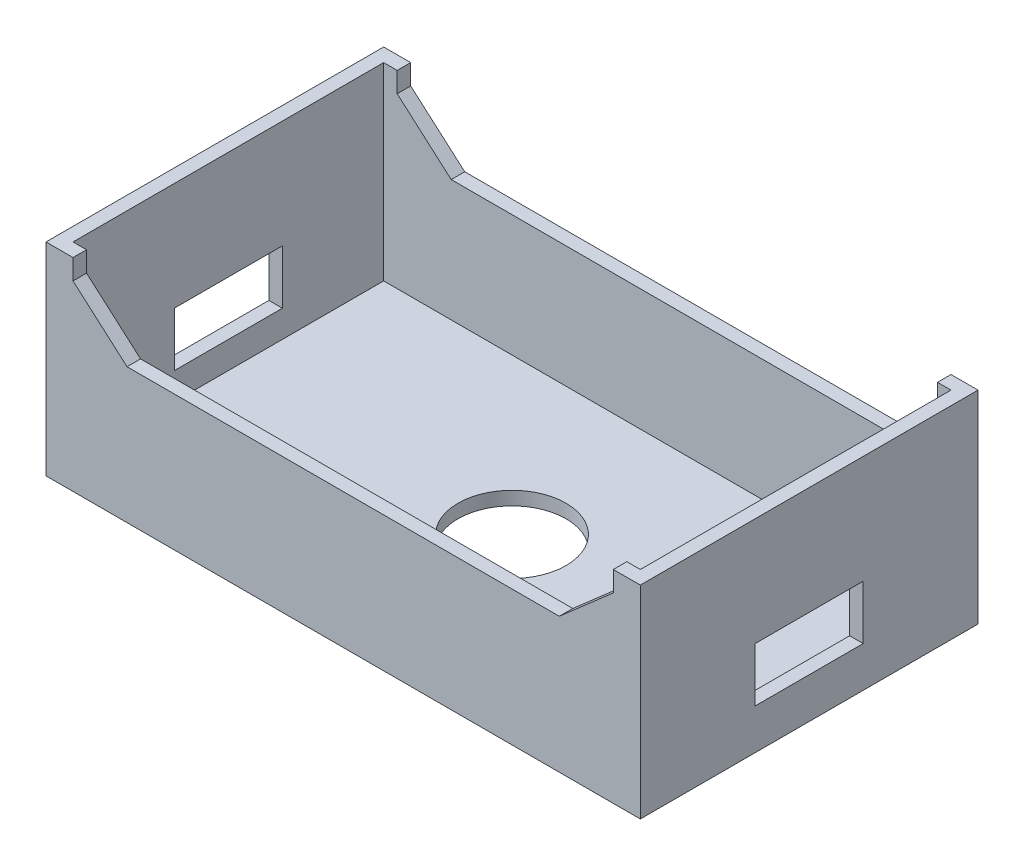
ISO-10303-21;
HEADER;
FILE_DESCRIPTION(('STEP AP214'),'2;1');
FILE_NAME('part.step','',(''),(''),'','','');
FILE_SCHEMA(('AUTOMOTIVE_DESIGN { 1 0 10303 214 1 1 1 1 }'));
ENDSEC;
DATA;
#1=APPLICATION_CONTEXT('core data for automotive mechanical design processes');
#2=APPLICATION_PROTOCOL_DEFINITION('international standard','automotive_design',2000,#1);
#3=PRODUCT_CONTEXT('',#1,'mechanical');
#4=PRODUCT('Part','Part','',(#3));
#5=PRODUCT_RELATED_PRODUCT_CATEGORY('part','',(#4));
#6=PRODUCT_DEFINITION_FORMATION('','',#4);
#7=PRODUCT_DEFINITION_CONTEXT('part definition',#1,'design');
#8=PRODUCT_DEFINITION('design','',#6,#7);
#9=PRODUCT_DEFINITION_SHAPE('','',#8);
#10=(LENGTH_UNIT() NAMED_UNIT(*) SI_UNIT(.MILLI.,.METRE.));
#11=(NAMED_UNIT(*) PLANE_ANGLE_UNIT() SI_UNIT($,.RADIAN.));
#12=(NAMED_UNIT(*) SI_UNIT($,.STERADIAN.) SOLID_ANGLE_UNIT());
#13=UNCERTAINTY_MEASURE_WITH_UNIT(LENGTH_MEASURE(1.E-05),#10,'distance_accuracy_value','');
#14=(GEOMETRIC_REPRESENTATION_CONTEXT(3) GLOBAL_UNCERTAINTY_ASSIGNED_CONTEXT((#13)) GLOBAL_UNIT_ASSIGNED_CONTEXT((#10,
#11,#12)) REPRESENTATION_CONTEXT('',''));
#15=CARTESIAN_POINT('',(0.,0.,0.));
#16=DIRECTION('',(0.,0.,1.));
#17=DIRECTION('',(1.,0.,0.));
#18=AXIS2_PLACEMENT_3D('',#15,#16,#17);
#19=CARTESIAN_POINT('',(21.,1.,-11.5));
#20=DIRECTION('',(0.,0.,-1.));
#21=DIRECTION('',(-1.,0.,0.));
#22=AXIS2_PLACEMENT_3D('',#19,#20,#21);
#23=PLANE('',#22);
#24=DIRECTION('',(0.,1.,0.));
#25=VECTOR('',#24,1.);
#26=CARTESIAN_POINT('',(21.,1.,-11.5));
#27=LINE('',#26,#25);
#28=CARTESIAN_POINT('',(21.,1.,-11.5));
#29=VERTEX_POINT('',#28);
#30=CARTESIAN_POINT('',(21.,15.,-11.5));
#31=VERTEX_POINT('',#30);
#32=EDGE_CURVE('E397',#29,#31,#27,.T.);
#33=ORIENTED_EDGE('',*,*,#32,.T.);
#34=DIRECTION('',(-1.,0.,0.));
#35=VECTOR('',#34,1.);
#36=CARTESIAN_POINT('',(0.,15.,-11.5));
#37=LINE('',#36,#35);
#38=CARTESIAN_POINT('',(20.,15.,-11.5));
#39=VERTEX_POINT('',#38);
#40=EDGE_CURVE('E298',#31,#39,#37,.T.);
#41=ORIENTED_EDGE('',*,*,#40,.T.);
#42=DIRECTION('',(0.,1.,0.));
#43=VECTOR('',#42,1.);
#44=CARTESIAN_POINT('',(20.,0.,-11.5));
#45=LINE('',#44,#43);
#46=CARTESIAN_POINT('',(20.,13.5,-11.5));
#47=VERTEX_POINT('',#46);
#48=EDGE_CURVE('E43',#47,#39,#45,.T.);
#49=ORIENTED_EDGE('',*,*,#48,.F.);
#50=DIRECTION('',(-0.752576694706878,-0.658504607868518,0.));
#51=VECTOR('',#50,1.);
#52=CARTESIAN_POINT('',(1.98230088495574,-2.26548672566371,-11.5));
#53=LINE('',#52,#51);
#54=CARTESIAN_POINT('',(16.,10.,-11.5));
#55=VERTEX_POINT('',#54);
#56=EDGE_CURVE('E296',#47,#55,#53,.T.);
#57=ORIENTED_EDGE('',*,*,#56,.T.);
#58=DIRECTION('',(-1.,0.,0.));
#59=VECTOR('',#58,1.);
#60=CARTESIAN_POINT('',(21.,10.,-11.5));
#61=LINE('',#60,#59);
#62=CARTESIAN_POINT('',(-16.,10.,-11.5));
#63=VERTEX_POINT('',#62);
#64=EDGE_CURVE('E380',#55,#63,#61,.T.);
#65=ORIENTED_EDGE('',*,*,#64,.T.);
#66=DIRECTION('',(0.752576694706878,-0.658504607868518,0.));
#67=VECTOR('',#66,1.);
#68=CARTESIAN_POINT('',(-1.98230088495574,-2.26548672566371,-11.5));
#69=LINE('',#68,#67);
#70=CARTESIAN_POINT('',(-20.,13.5,-11.5));
#71=VERTEX_POINT('',#70);
#72=EDGE_CURVE('E300',#71,#63,#69,.T.);
#73=ORIENTED_EDGE('',*,*,#72,.F.);
#74=DIRECTION('',(0.,1.,0.));
#75=VECTOR('',#74,1.);
#76=CARTESIAN_POINT('',(-20.,0.,-11.5));
#77=LINE('',#76,#75);
#78=CARTESIAN_POINT('',(-20.,15.,-11.5));
#79=VERTEX_POINT('',#78);
#80=EDGE_CURVE('E302',#71,#79,#77,.T.);
#81=ORIENTED_EDGE('',*,*,#80,.T.);
#82=DIRECTION('',(-1.,0.,0.));
#83=VECTOR('',#82,1.);
#84=CARTESIAN_POINT('',(0.,15.,-11.5));
#85=LINE('',#84,#83);
#86=CARTESIAN_POINT('',(-21.,15.,-11.5));
#87=VERTEX_POINT('',#86);
#88=EDGE_CURVE('E304',#79,#87,#85,.T.);
#89=ORIENTED_EDGE('',*,*,#88,.T.);
#90=DIRECTION('',(0.,1.,0.));
#91=VECTOR('',#90,1.);
#92=CARTESIAN_POINT('',(-21.,1.,-11.5));
#93=LINE('',#92,#91);
#94=CARTESIAN_POINT('',(-21.,1.,-11.5));
#95=VERTEX_POINT('',#94);
#96=EDGE_CURVE('E394',#95,#87,#93,.T.);
#97=ORIENTED_EDGE('',*,*,#96,.F.);
#98=DIRECTION('',(-1.,0.,0.));
#99=VECTOR('',#98,1.);
#100=CARTESIAN_POINT('',(21.,1.,-11.5));
#101=LINE('',#100,#99);
#102=EDGE_CURVE('E386',#29,#95,#101,.T.);
#103=ORIENTED_EDGE('',*,*,#102,.F.);
#104=EDGE_LOOP('',(#33,#41,#49,#57,#65,#73,#81,#89,#97,#103));
#105=FACE_BOUND('',#104,.T.);
#106=ADVANCED_FACE('F34',(#105),#23,.F.);
#107=CARTESIAN_POINT('',(21.,1.,11.5));
#108=DIRECTION('',(0.,0.,1.));
#109=DIRECTION('',(1.,0.,0.));
#110=AXIS2_PLACEMENT_3D('',#107,#108,#109);
#111=PLANE('',#110);
#112=DIRECTION('',(1.,0.,0.));
#113=VECTOR('',#112,1.);
#114=CARTESIAN_POINT('',(0.,15.,11.5));
#115=LINE('',#114,#113);
#116=CARTESIAN_POINT('',(20.,15.,11.5));
#117=VERTEX_POINT('',#116);
#118=CARTESIAN_POINT('',(21.,15.,11.5));
#119=VERTEX_POINT('',#118);
#120=EDGE_CURVE('E309',#117,#119,#115,.T.);
#121=ORIENTED_EDGE('',*,*,#120,.T.);
#122=DIRECTION('',(0.,1.,0.));
#123=VECTOR('',#122,1.);
#124=CARTESIAN_POINT('',(21.,1.,11.5));
#125=LINE('',#124,#123);
#126=CARTESIAN_POINT('',(21.,1.,11.5));
#127=VERTEX_POINT('',#126);
#128=EDGE_CURVE('E399',#127,#119,#125,.T.);
#129=ORIENTED_EDGE('',*,*,#128,.F.);
#130=DIRECTION('',(1.,0.,0.));
#131=VECTOR('',#130,1.);
#132=CARTESIAN_POINT('',(21.,1.,11.5));
#133=LINE('',#132,#131);
#134=CARTESIAN_POINT('',(-21.,1.,11.5));
#135=VERTEX_POINT('',#134);
#136=EDGE_CURVE('E379',#135,#127,#133,.T.);
#137=ORIENTED_EDGE('',*,*,#136,.F.);
#138=DIRECTION('',(0.,1.,0.));
#139=VECTOR('',#138,1.);
#140=CARTESIAN_POINT('',(-21.,1.,11.5));
#141=LINE('',#140,#139);
#142=CARTESIAN_POINT('',(-21.,15.,11.5));
#143=VERTEX_POINT('',#142);
#144=EDGE_CURVE('E389',#135,#143,#141,.T.);
#145=ORIENTED_EDGE('',*,*,#144,.T.);
#146=DIRECTION('',(1.,0.,0.));
#147=VECTOR('',#146,1.);
#148=CARTESIAN_POINT('',(0.,15.,11.5));
#149=LINE('',#148,#147);
#150=CARTESIAN_POINT('',(-20.,15.,11.5));
#151=VERTEX_POINT('',#150);
#152=EDGE_CURVE('E317',#143,#151,#149,.T.);
#153=ORIENTED_EDGE('',*,*,#152,.T.);
#154=DIRECTION('',(0.,-1.,0.));
#155=VECTOR('',#154,1.);
#156=CARTESIAN_POINT('',(-20.,0.,11.5));
#157=LINE('',#156,#155);
#158=CARTESIAN_POINT('',(-20.,13.5,11.5));
#159=VERTEX_POINT('',#158);
#160=EDGE_CURVE('E315',#151,#159,#157,.T.);
#161=ORIENTED_EDGE('',*,*,#160,.T.);
#162=DIRECTION('',(-0.752576694706878,0.658504607868518,0.));
#163=VECTOR('',#162,1.);
#164=CARTESIAN_POINT('',(-1.98230088495574,-2.26548672566371,11.5));
#165=LINE('',#164,#163);
#166=CARTESIAN_POINT('',(-16.,9.99999999999999,11.5));
#167=VERTEX_POINT('',#166);
#168=EDGE_CURVE('E312',#167,#159,#165,.T.);
#169=ORIENTED_EDGE('',*,*,#168,.F.);
#170=DIRECTION('',(1.,0.,0.));
#171=VECTOR('',#170,1.);
#172=CARTESIAN_POINT('',(21.,10.,11.5));
#173=LINE('',#172,#171);
#174=CARTESIAN_POINT('',(16.,10.,11.5));
#175=VERTEX_POINT('',#174);
#176=EDGE_CURVE('E367',#167,#175,#173,.T.);
#177=ORIENTED_EDGE('',*,*,#176,.T.);
#178=DIRECTION('',(0.752576694706878,0.658504607868518,0.));
#179=VECTOR('',#178,1.);
#180=CARTESIAN_POINT('',(1.98230088495574,-2.26548672566371,11.5));
#181=LINE('',#180,#179);
#182=CARTESIAN_POINT('',(20.,13.5,11.5));
#183=VERTEX_POINT('',#182);
#184=EDGE_CURVE('E307',#175,#183,#181,.T.);
#185=ORIENTED_EDGE('',*,*,#184,.T.);
#186=DIRECTION('',(0.,-1.,0.));
#187=VECTOR('',#186,1.);
#188=CARTESIAN_POINT('',(20.,0.,11.5));
#189=LINE('',#188,#187);
#190=EDGE_CURVE('E11',#117,#183,#189,.T.);
#191=ORIENTED_EDGE('',*,*,#190,.F.);
#192=EDGE_LOOP('',(#121,#129,#137,#145,#153,#161,#169,#177,#185,#191));
#193=FACE_BOUND('',#192,.T.);
#194=ADVANCED_FACE('F479',(#193),#111,.F.);
#195=CARTESIAN_POINT('',(22.,10.,12.5));
#196=DIRECTION('',(0.,0.,-1.));
#197=DIRECTION('',(-1.,0.,0.));
#198=AXIS2_PLACEMENT_3D('',#195,#196,#197);
#199=PLANE('',#198);
#200=DIRECTION('',(1.,0.,0.));
#201=VECTOR('',#200,1.);
#202=CARTESIAN_POINT('',(0.,15.,12.5));
#203=LINE('',#202,#201);
#204=CARTESIAN_POINT('',(-22.,15.,12.5));
#205=VERTEX_POINT('',#204);
#206=CARTESIAN_POINT('',(-20.,15.,12.5));
#207=VERTEX_POINT('',#206);
#208=EDGE_CURVE('E353',#205,#207,#203,.T.);
#209=ORIENTED_EDGE('',*,*,#208,.F.);
#210=DIRECTION('',(0.,-1.,0.));
#211=VECTOR('',#210,1.);
#212=CARTESIAN_POINT('',(-22.,10.,12.5));
#213=LINE('',#212,#211);
#214=CARTESIAN_POINT('',(-22.,0.,12.5));
#215=VERTEX_POINT('',#214);
#216=EDGE_CURVE('E424',#205,#215,#213,.T.);
#217=ORIENTED_EDGE('',*,*,#216,.T.);
#218=DIRECTION('',(1.,0.,0.));
#219=VECTOR('',#218,1.);
#220=CARTESIAN_POINT('',(22.,0.,12.5));
#221=LINE('',#220,#219);
#222=CARTESIAN_POINT('',(22.,0.,12.5));
#223=VERTEX_POINT('',#222);
#224=EDGE_CURVE('E411',#215,#223,#221,.T.);
#225=ORIENTED_EDGE('',*,*,#224,.T.);
#226=DIRECTION('',(0.,-1.,0.));
#227=VECTOR('',#226,1.);
#228=CARTESIAN_POINT('',(22.,10.,12.5));
#229=LINE('',#228,#227);
#230=CARTESIAN_POINT('',(22.,15.,12.5));
#231=VERTEX_POINT('',#230);
#232=EDGE_CURVE('E422',#231,#223,#229,.T.);
#233=ORIENTED_EDGE('',*,*,#232,.F.);
#234=DIRECTION('',(1.,0.,0.));
#235=VECTOR('',#234,1.);
#236=CARTESIAN_POINT('',(0.,15.,12.5));
#237=LINE('',#236,#235);
#238=CARTESIAN_POINT('',(20.,15.,12.5));
#239=VERTEX_POINT('',#238);
#240=EDGE_CURVE('E319',#239,#231,#237,.T.);
#241=ORIENTED_EDGE('',*,*,#240,.F.);
#242=DIRECTION('',(0.,-1.,0.));
#243=VECTOR('',#242,1.);
#244=CARTESIAN_POINT('',(20.,0.,12.5));
#245=LINE('',#244,#243);
#246=CARTESIAN_POINT('',(20.,13.5,12.5));
#247=VERTEX_POINT('',#246);
#248=EDGE_CURVE('E332',#239,#247,#245,.T.);
#249=ORIENTED_EDGE('',*,*,#248,.T.);
#250=DIRECTION('',(0.752576694706878,0.658504607868518,0.));
#251=VECTOR('',#250,1.);
#252=CARTESIAN_POINT('',(1.98230088495574,-2.26548672566371,12.5));
#253=LINE('',#252,#251);
#254=CARTESIAN_POINT('',(16.,10.,12.5));
#255=VERTEX_POINT('',#254);
#256=EDGE_CURVE('E324',#255,#247,#253,.T.);
#257=ORIENTED_EDGE('',*,*,#256,.F.);
#258=DIRECTION('',(1.,0.,0.));
#259=VECTOR('',#258,1.);
#260=CARTESIAN_POINT('',(22.,10.,12.5));
#261=LINE('',#260,#259);
#262=CARTESIAN_POINT('',(-16.,10.,12.5));
#263=VERTEX_POINT('',#262);
#264=EDGE_CURVE('E402',#263,#255,#261,.T.);
#265=ORIENTED_EDGE('',*,*,#264,.F.);
#266=DIRECTION('',(-0.752576694706878,0.658504607868518,0.));
#267=VECTOR('',#266,1.);
#268=CARTESIAN_POINT('',(-1.98230088495574,-2.26548672566371,12.5));
#269=LINE('',#268,#267);
#270=CARTESIAN_POINT('',(-20.,13.5,12.5));
#271=VERTEX_POINT('',#270);
#272=EDGE_CURVE('E340',#263,#271,#269,.T.);
#273=ORIENTED_EDGE('',*,*,#272,.T.);
#274=DIRECTION('',(0.,-1.,0.));
#275=VECTOR('',#274,1.);
#276=CARTESIAN_POINT('',(-20.,0.,12.5));
#277=LINE('',#276,#275);
#278=EDGE_CURVE('E360',#207,#271,#277,.T.);
#279=ORIENTED_EDGE('',*,*,#278,.F.);
#280=EDGE_LOOP('',(#209,#217,#225,#233,#241,#249,#257,#265,#273,#279));
#281=FACE_BOUND('',#280,.T.);
#282=ADVANCED_FACE('F492',(#281),#199,.F.);
#283=CARTESIAN_POINT('',(22.,10.,-12.5));
#284=DIRECTION('',(0.,0.,1.));
#285=DIRECTION('',(1.,0.,0.));
#286=AXIS2_PLACEMENT_3D('',#283,#284,#285);
#287=PLANE('',#286);
#288=DIRECTION('',(0.,-1.,0.));
#289=VECTOR('',#288,1.);
#290=CARTESIAN_POINT('',(-22.,10.,-12.5));
#291=LINE('',#290,#289);
#292=CARTESIAN_POINT('',(-22.,15.,-12.5));
#293=VERTEX_POINT('',#292);
#294=CARTESIAN_POINT('',(-22.,0.,-12.5));
#295=VERTEX_POINT('',#294);
#296=EDGE_CURVE('E408',#293,#295,#291,.T.);
#297=ORIENTED_EDGE('',*,*,#296,.F.);
#298=DIRECTION('',(1.,0.,0.));
#299=VECTOR('',#298,1.);
#300=CARTESIAN_POINT('',(0.,15.,-12.5));
#301=LINE('',#300,#299);
#302=CARTESIAN_POINT('',(-20.,15.,-12.5));
#303=VERTEX_POINT('',#302);
#304=EDGE_CURVE('E355',#293,#303,#301,.T.);
#305=ORIENTED_EDGE('',*,*,#304,.T.);
#306=DIRECTION('',(0.,-1.,0.));
#307=VECTOR('',#306,1.);
#308=CARTESIAN_POINT('',(-20.,0.,-12.5));
#309=LINE('',#308,#307);
#310=CARTESIAN_POINT('',(-20.,13.5,-12.5));
#311=VERTEX_POINT('',#310);
#312=EDGE_CURVE('E352',#303,#311,#309,.T.);
#313=ORIENTED_EDGE('',*,*,#312,.T.);
#314=DIRECTION('',(-0.752576694706878,0.658504607868518,0.));
#315=VECTOR('',#314,1.);
#316=CARTESIAN_POINT('',(-1.98230088495574,-2.26548672566371,-12.5));
#317=LINE('',#316,#315);
#318=CARTESIAN_POINT('',(-16.,10.,-12.5));
#319=VERTEX_POINT('',#318);
#320=EDGE_CURVE('E349',#319,#311,#317,.T.);
#321=ORIENTED_EDGE('',*,*,#320,.F.);
#322=DIRECTION('',(-1.,0.,0.));
#323=VECTOR('',#322,1.);
#324=CARTESIAN_POINT('',(22.,10.,-12.5));
#325=LINE('',#324,#323);
#326=CARTESIAN_POINT('',(16.,10.,-12.5));
#327=VERTEX_POINT('',#326);
#328=EDGE_CURVE('E405',#327,#319,#325,.T.);
#329=ORIENTED_EDGE('',*,*,#328,.F.);
#330=DIRECTION('',(0.752576694706878,0.658504607868518,0.));
#331=VECTOR('',#330,1.);
#332=CARTESIAN_POINT('',(1.98230088495574,-2.26548672566371,-12.5));
#333=LINE('',#332,#331);
#334=CARTESIAN_POINT('',(20.,13.5,-12.5));
#335=VERTEX_POINT('',#334);
#336=EDGE_CURVE('E327',#327,#335,#333,.T.);
#337=ORIENTED_EDGE('',*,*,#336,.T.);
#338=DIRECTION('',(0.,-1.,0.));
#339=VECTOR('',#338,1.);
#340=CARTESIAN_POINT('',(20.,0.,-12.5));
#341=LINE('',#340,#339);
#342=CARTESIAN_POINT('',(20.,15.,-12.5));
#343=VERTEX_POINT('',#342);
#344=EDGE_CURVE('E323',#343,#335,#341,.T.);
#345=ORIENTED_EDGE('',*,*,#344,.F.);
#346=DIRECTION('',(1.,0.,0.));
#347=VECTOR('',#346,1.);
#348=CARTESIAN_POINT('',(0.,15.,-12.5));
#349=LINE('',#348,#347);
#350=CARTESIAN_POINT('',(22.,15.,-12.5));
#351=VERTEX_POINT('',#350);
#352=EDGE_CURVE('E320',#343,#351,#349,.T.);
#353=ORIENTED_EDGE('',*,*,#352,.T.);
#354=DIRECTION('',(0.,-1.,0.));
#355=VECTOR('',#354,1.);
#356=CARTESIAN_POINT('',(22.,10.,-12.5));
#357=LINE('',#356,#355);
#358=CARTESIAN_POINT('',(22.,0.,-12.5));
#359=VERTEX_POINT('',#358);
#360=EDGE_CURVE('E420',#351,#359,#357,.T.);
#361=ORIENTED_EDGE('',*,*,#360,.T.);
#362=DIRECTION('',(-1.,0.,0.));
#363=VECTOR('',#362,1.);
#364=CARTESIAN_POINT('',(22.,0.,-12.5));
#365=LINE('',#364,#363);
#366=EDGE_CURVE('E406',#359,#295,#365,.T.);
#367=ORIENTED_EDGE('',*,*,#366,.T.);
#368=EDGE_LOOP('',(#297,#305,#313,#321,#329,#337,#345,#353,#361,#367));
#369=FACE_BOUND('',#368,.T.);
#370=ADVANCED_FACE('F441',(#369),#287,.F.);
#371=CARTESIAN_POINT('',(0.,15.,-12.5));
#372=DIRECTION('',(0.,-1.,0.));
#373=DIRECTION('',(0.,0.,-1.));
#374=AXIS2_PLACEMENT_3D('',#371,#372,#373);
#375=PLANE('',#374);
#376=ORIENTED_EDGE('',*,*,#304,.F.);
#377=DIRECTION('',(0.,0.,-1.));
#378=VECTOR('',#377,1.);
#379=CARTESIAN_POINT('',(-22.,15.,-12.5));
#380=LINE('',#379,#378);
#381=EDGE_CURVE('E292',#205,#293,#380,.T.);
#382=ORIENTED_EDGE('',*,*,#381,.F.);
#383=ORIENTED_EDGE('',*,*,#208,.T.);
#384=DIRECTION('',(0.,0.,1.));
#385=VECTOR('',#384,1.);
#386=CARTESIAN_POINT('',(-20.,15.,-12.5));
#387=LINE('',#386,#385);
#388=EDGE_CURVE('E368',#151,#207,#387,.T.);
#389=ORIENTED_EDGE('',*,*,#388,.F.);
#390=ORIENTED_EDGE('',*,*,#152,.F.);
#391=DIRECTION('',(0.,0.,-1.));
#392=VECTOR('',#391,1.);
#393=CARTESIAN_POINT('',(-21.,15.,0.));
#394=LINE('',#393,#392);
#395=EDGE_CURVE('E289',#143,#87,#394,.T.);
#396=ORIENTED_EDGE('',*,*,#395,.T.);
#397=ORIENTED_EDGE('',*,*,#88,.F.);
#398=EDGE_CURVE('E364',#303,#79,#387,.T.);
#399=ORIENTED_EDGE('',*,*,#398,.F.);
#400=EDGE_LOOP('',(#376,#382,#383,#389,#390,#396,#397,#399));
#401=FACE_BOUND('',#400,.T.);
#402=ADVANCED_FACE('F462',(#401),#375,.F.);
#403=CARTESIAN_POINT('',(0.,15.,-12.5));
#404=DIRECTION('',(0.,-1.,0.));
#405=DIRECTION('',(1.,0.,0.));
#406=AXIS2_PLACEMENT_3D('',#403,#404,#405);
#407=PLANE('',#406);
#408=ORIENTED_EDGE('',*,*,#240,.T.);
#409=DIRECTION('',(0.,0.,1.));
#410=VECTOR('',#409,1.);
#411=CARTESIAN_POINT('',(22.,15.,-12.5));
#412=LINE('',#411,#410);
#413=EDGE_CURVE('E294',#351,#231,#412,.T.);
#414=ORIENTED_EDGE('',*,*,#413,.F.);
#415=ORIENTED_EDGE('',*,*,#352,.F.);
#416=DIRECTION('',(0.,0.,1.));
#417=VECTOR('',#416,1.);
#418=CARTESIAN_POINT('',(20.,15.,-12.5));
#419=LINE('',#418,#417);
#420=EDGE_CURVE('E346',#343,#39,#419,.T.);
#421=ORIENTED_EDGE('',*,*,#420,.T.);
#422=ORIENTED_EDGE('',*,*,#40,.F.);
#423=DIRECTION('',(0.,0.,-1.));
#424=VECTOR('',#423,1.);
#425=CARTESIAN_POINT('',(21.,15.,0.));
#426=LINE('',#425,#424);
#427=EDGE_CURVE('E286',#119,#31,#426,.T.);
#428=ORIENTED_EDGE('',*,*,#427,.F.);
#429=ORIENTED_EDGE('',*,*,#120,.F.);
#430=EDGE_CURVE('E329',#117,#239,#419,.T.);
#431=ORIENTED_EDGE('',*,*,#430,.T.);
#432=EDGE_LOOP('',(#408,#414,#415,#421,#422,#428,#429,#431));
#433=FACE_BOUND('',#432,.T.);
#434=ADVANCED_FACE('F435',(#433),#407,.F.);
#435=CARTESIAN_POINT('',(21.,1.,11.5));
#436=DIRECTION('',(1.,0.,0.));
#437=DIRECTION('',(0.,0.,-1.));
#438=AXIS2_PLACEMENT_3D('',#435,#436,#437);
#439=PLANE('',#438);
#440=DIRECTION('',(0.,0.,1.));
#441=VECTOR('',#440,1.);
#442=CARTESIAN_POINT('',(21.,7.00000000000001,11.5));
#443=LINE('',#442,#441);
#444=CARTESIAN_POINT('',(21.,7.00000000000001,-4.00000000000001));
#445=VERTEX_POINT('',#444);
#446=CARTESIAN_POINT('',(21.,7.00000000000001,3.99999999999999));
#447=VERTEX_POINT('',#446);
#448=EDGE_CURVE('E258',#445,#447,#443,.T.);
#449=ORIENTED_EDGE('',*,*,#448,.T.);
#450=DIRECTION('',(0.,-1.,0.));
#451=VECTOR('',#450,1.);
#452=CARTESIAN_POINT('',(21.,1.,3.99999999999999));
#453=LINE('',#452,#451);
#454=CARTESIAN_POINT('',(21.,3.00000000000001,3.99999999999999));
#455=VERTEX_POINT('',#454);
#456=EDGE_CURVE('E283',#447,#455,#453,.T.);
#457=ORIENTED_EDGE('',*,*,#456,.T.);
#458=DIRECTION('',(0.,0.,-1.));
#459=VECTOR('',#458,1.);
#460=CARTESIAN_POINT('',(21.,3.00000000000001,11.5));
#461=LINE('',#460,#459);
#462=CARTESIAN_POINT('',(21.,3.00000000000001,-4.00000000000001));
#463=VERTEX_POINT('',#462);
#464=EDGE_CURVE('E274',#455,#463,#461,.T.);
#465=ORIENTED_EDGE('',*,*,#464,.T.);
#466=DIRECTION('',(0.,1.,0.));
#467=VECTOR('',#466,1.);
#468=CARTESIAN_POINT('',(21.,0.999999999999997,-4.00000000000001));
#469=LINE('',#468,#467);
#470=EDGE_CURVE('E265',#463,#445,#469,.T.);
#471=ORIENTED_EDGE('',*,*,#470,.T.);
#472=EDGE_LOOP('',(#449,#457,#465,#471));
#473=FACE_BOUND('',#472,.T.);
#474=ORIENTED_EDGE('',*,*,#128,.T.);
#475=ORIENTED_EDGE('',*,*,#427,.T.);
#476=ORIENTED_EDGE('',*,*,#32,.F.);
#477=DIRECTION('',(0.,0.,-1.));
#478=VECTOR('',#477,1.);
#479=CARTESIAN_POINT('',(21.,1.,11.5));
#480=LINE('',#479,#478);
#481=EDGE_CURVE('E383',#127,#29,#480,.T.);
#482=ORIENTED_EDGE('',*,*,#481,.F.);
#483=EDGE_LOOP('',(#474,#475,#476,#482));
#484=FACE_BOUND('',#483,.T.);
#485=ADVANCED_FACE('F475',(#473,#484),#439,.F.);
#486=CARTESIAN_POINT('',(-21.,1.,11.5));
#487=DIRECTION('',(-1.,0.,0.));
#488=DIRECTION('',(0.,0.,1.));
#489=AXIS2_PLACEMENT_3D('',#486,#487,#488);
#490=PLANE('',#489);
#491=DIRECTION('',(0.,0.,1.));
#492=VECTOR('',#491,1.);
#493=CARTESIAN_POINT('',(-21.,3.00000000000001,11.5));
#494=LINE('',#493,#492);
#495=CARTESIAN_POINT('',(-21.,3.00000000000001,-4.00000000000001));
#496=VERTEX_POINT('',#495);
#497=CARTESIAN_POINT('',(-21.,3.00000000000001,3.99999999999999));
#498=VERTEX_POINT('',#497);
#499=EDGE_CURVE('E271',#496,#498,#494,.T.);
#500=ORIENTED_EDGE('',*,*,#499,.T.);
#501=DIRECTION('',(0.,1.,0.));
#502=VECTOR('',#501,1.);
#503=CARTESIAN_POINT('',(-21.,1.,3.99999999999999));
#504=LINE('',#503,#502);
#505=CARTESIAN_POINT('',(-21.,7.00000000000001,3.99999999999999));
#506=VERTEX_POINT('',#505);
#507=EDGE_CURVE('E280',#498,#506,#504,.T.);
#508=ORIENTED_EDGE('',*,*,#507,.T.);
#509=DIRECTION('',(0.,0.,-1.));
#510=VECTOR('',#509,1.);
#511=CARTESIAN_POINT('',(-21.,7.00000000000001,11.5));
#512=LINE('',#511,#510);
#513=CARTESIAN_POINT('',(-21.,7.00000000000001,-4.00000000000001));
#514=VERTEX_POINT('',#513);
#515=EDGE_CURVE('E256',#506,#514,#512,.T.);
#516=ORIENTED_EDGE('',*,*,#515,.T.);
#517=DIRECTION('',(0.,-1.,0.));
#518=VECTOR('',#517,1.);
#519=CARTESIAN_POINT('',(-21.,0.999999999999997,-4.00000000000001));
#520=LINE('',#519,#518);
#521=EDGE_CURVE('E225',#514,#496,#520,.T.);
#522=ORIENTED_EDGE('',*,*,#521,.T.);
#523=EDGE_LOOP('',(#500,#508,#516,#522));
#524=FACE_BOUND('',#523,.T.);
#525=ORIENTED_EDGE('',*,*,#96,.T.);
#526=ORIENTED_EDGE('',*,*,#395,.F.);
#527=ORIENTED_EDGE('',*,*,#144,.F.);
#528=DIRECTION('',(0.,0.,1.));
#529=VECTOR('',#528,1.);
#530=CARTESIAN_POINT('',(-21.,1.,11.5));
#531=LINE('',#530,#529);
#532=EDGE_CURVE('E376',#95,#135,#531,.T.);
#533=ORIENTED_EDGE('',*,*,#532,.F.);
#534=EDGE_LOOP('',(#525,#526,#527,#533));
#535=FACE_BOUND('',#534,.T.);
#536=ADVANCED_FACE('F467',(#524,#535),#490,.F.);
#537=CARTESIAN_POINT('',(-20.,0.,-12.5));
#538=DIRECTION('',(-1.,0.,0.));
#539=DIRECTION('',(0.,0.,1.));
#540=AXIS2_PLACEMENT_3D('',#537,#538,#539);
#541=PLANE('',#540);
#542=ORIENTED_EDGE('',*,*,#160,.F.);
#543=ORIENTED_EDGE('',*,*,#388,.T.);
#544=ORIENTED_EDGE('',*,*,#278,.T.);
#545=DIRECTION('',(0.,0.,1.));
#546=VECTOR('',#545,1.);
#547=CARTESIAN_POINT('',(-20.,13.5,-12.5));
#548=LINE('',#547,#546);
#549=EDGE_CURVE('E372',#159,#271,#548,.T.);
#550=ORIENTED_EDGE('',*,*,#549,.F.);
#551=EDGE_LOOP('',(#542,#543,#544,#550));
#552=FACE_BOUND('',#551,.T.);
#553=ADVANCED_FACE('F508',(#552),#541,.F.);
#554=ORIENTED_EDGE('',*,*,#80,.F.);
#555=EDGE_CURVE('E369',#311,#71,#548,.T.);
#556=ORIENTED_EDGE('',*,*,#555,.F.);
#557=ORIENTED_EDGE('',*,*,#312,.F.);
#558=ORIENTED_EDGE('',*,*,#398,.T.);
#559=EDGE_LOOP('',(#554,#556,#557,#558));
#560=FACE_BOUND('',#559,.T.);
#561=ADVANCED_FACE('F459',(#560),#541,.F.);
#562=CARTESIAN_POINT('',(-1.98230088495574,-2.26548672566371,-12.5));
#563=DIRECTION('',(0.658504607868518,0.752576694706878,0.));
#564=DIRECTION('',(-0.752576694706878,0.658504607868518,0.));
#565=AXIS2_PLACEMENT_3D('',#562,#563,#564);
#566=PLANE('',#565);
#567=DIRECTION('',(0.,0.,1.));
#568=VECTOR('',#567,1.);
#569=CARTESIAN_POINT('',(-16.,10.,-12.5));
#570=LINE('',#569,#568);
#571=EDGE_CURVE('E357',#167,#263,#570,.T.);
#572=ORIENTED_EDGE('',*,*,#571,.F.);
#573=ORIENTED_EDGE('',*,*,#168,.T.);
#574=ORIENTED_EDGE('',*,*,#549,.T.);
#575=ORIENTED_EDGE('',*,*,#272,.F.);
#576=EDGE_LOOP('',(#572,#573,#574,#575));
#577=FACE_BOUND('',#576,.T.);
#578=ADVANCED_FACE('F511',(#577),#566,.T.);
#579=ORIENTED_EDGE('',*,*,#555,.T.);
#580=ORIENTED_EDGE('',*,*,#72,.T.);
#581=EDGE_CURVE('E373',#319,#63,#570,.T.);
#582=ORIENTED_EDGE('',*,*,#581,.F.);
#583=ORIENTED_EDGE('',*,*,#320,.T.);
#584=EDGE_LOOP('',(#579,#580,#582,#583));
#585=FACE_BOUND('',#584,.T.);
#586=ADVANCED_FACE('F453',(#585),#566,.T.);
#587=CARTESIAN_POINT('',(1.98230088495574,-2.26548672566371,-12.5));
#588=DIRECTION('',(0.658504607868518,-0.752576694706878,0.));
#589=DIRECTION('',(0.752576694706878,0.658504607868518,0.));
#590=AXIS2_PLACEMENT_3D('',#587,#588,#589);
#591=PLANE('',#590);
#592=ORIENTED_EDGE('',*,*,#184,.F.);
#593=DIRECTION('',(0.,0.,1.));
#594=VECTOR('',#593,1.);
#595=CARTESIAN_POINT('',(16.,10.,-12.5));
#596=LINE('',#595,#594);
#597=EDGE_CURVE('E341',#175,#255,#596,.T.);
#598=ORIENTED_EDGE('',*,*,#597,.T.);
#599=ORIENTED_EDGE('',*,*,#256,.T.);
#600=DIRECTION('',(0.,0.,1.));
#601=VECTOR('',#600,1.);
#602=CARTESIAN_POINT('',(20.,13.5,-12.5));
#603=LINE('',#602,#601);
#604=EDGE_CURVE('E345',#183,#247,#603,.T.);
#605=ORIENTED_EDGE('',*,*,#604,.F.);
#606=EDGE_LOOP('',(#592,#598,#599,#605));
#607=FACE_BOUND('',#606,.T.);
#608=ADVANCED_FACE('F485',(#607),#591,.F.);
#609=ORIENTED_EDGE('',*,*,#56,.F.);
#610=EDGE_CURVE('E342',#335,#47,#603,.T.);
#611=ORIENTED_EDGE('',*,*,#610,.F.);
#612=ORIENTED_EDGE('',*,*,#336,.F.);
#613=EDGE_CURVE('E337',#327,#55,#596,.T.);
#614=ORIENTED_EDGE('',*,*,#613,.T.);
#615=EDGE_LOOP('',(#609,#611,#612,#614));
#616=FACE_BOUND('',#615,.T.);
#617=ADVANCED_FACE('F446',(#616),#591,.F.);
#618=CARTESIAN_POINT('',(20.,0.,-12.5));
#619=DIRECTION('',(-1.,0.,0.));
#620=DIRECTION('',(0.,0.,1.));
#621=AXIS2_PLACEMENT_3D('',#618,#619,#620);
#622=PLANE('',#621);
#623=ORIENTED_EDGE('',*,*,#430,.F.);
#624=ORIENTED_EDGE('',*,*,#190,.T.);
#625=ORIENTED_EDGE('',*,*,#604,.T.);
#626=ORIENTED_EDGE('',*,*,#248,.F.);
#627=EDGE_LOOP('',(#623,#624,#625,#626));
#628=FACE_BOUND('',#627,.T.);
#629=ADVANCED_FACE('F482',(#628),#622,.T.);
#630=ORIENTED_EDGE('',*,*,#610,.T.);
#631=ORIENTED_EDGE('',*,*,#48,.T.);
#632=ORIENTED_EDGE('',*,*,#420,.F.);
#633=ORIENTED_EDGE('',*,*,#344,.T.);
#634=EDGE_LOOP('',(#630,#631,#632,#633));
#635=FACE_BOUND('',#634,.T.);
#636=ADVANCED_FACE('F428',(#635),#622,.T.);
#637=CARTESIAN_POINT('',(22.,10.,12.5));
#638=DIRECTION('',(-1.,0.,0.));
#639=DIRECTION('',(0.,0.,1.));
#640=AXIS2_PLACEMENT_3D('',#637,#638,#639);
#641=PLANE('',#640);
#642=DIRECTION('',(0.,0.,1.));
#643=VECTOR('',#642,1.);
#644=CARTESIAN_POINT('',(22.,3.00000000000001,12.5));
#645=LINE('',#644,#643);
#646=CARTESIAN_POINT('',(22.,3.00000000000001,-4.00000000000001));
#647=VERTEX_POINT('',#646);
#648=CARTESIAN_POINT('',(22.,3.00000000000001,3.99999999999999));
#649=VERTEX_POINT('',#648);
#650=EDGE_CURVE('E268',#647,#649,#645,.T.);
#651=ORIENTED_EDGE('',*,*,#650,.T.);
#652=DIRECTION('',(0.,1.,0.));
#653=VECTOR('',#652,1.);
#654=CARTESIAN_POINT('',(22.,10.,3.99999999999999));
#655=LINE('',#654,#653);
#656=CARTESIAN_POINT('',(22.,7.00000000000001,3.99999999999999));
#657=VERTEX_POINT('',#656);
#658=EDGE_CURVE('E277',#649,#657,#655,.T.);
#659=ORIENTED_EDGE('',*,*,#658,.T.);
#660=DIRECTION('',(0.,0.,-1.));
#661=VECTOR('',#660,1.);
#662=CARTESIAN_POINT('',(22.,7.00000000000001,12.5));
#663=LINE('',#662,#661);
#664=CARTESIAN_POINT('',(22.,7.00000000000001,-4.00000000000001));
#665=VERTEX_POINT('',#664);
#666=EDGE_CURVE('E253',#657,#665,#663,.T.);
#667=ORIENTED_EDGE('',*,*,#666,.T.);
#668=DIRECTION('',(0.,-1.,0.));
#669=VECTOR('',#668,1.);
#670=CARTESIAN_POINT('',(22.,10.,-4.00000000000001));
#671=LINE('',#670,#669);
#672=EDGE_CURVE('E261',#665,#647,#671,.T.);
#673=ORIENTED_EDGE('',*,*,#672,.T.);
#674=EDGE_LOOP('',(#651,#659,#667,#673));
#675=FACE_BOUND('',#674,.T.);
#676=ORIENTED_EDGE('',*,*,#413,.T.);
#677=ORIENTED_EDGE('',*,*,#232,.T.);
#678=DIRECTION('',(0.,0.,-1.));
#679=VECTOR('',#678,1.);
#680=CARTESIAN_POINT('',(22.,0.,12.5));
#681=LINE('',#680,#679);
#682=EDGE_CURVE('E414',#223,#359,#681,.T.);
#683=ORIENTED_EDGE('',*,*,#682,.T.);
#684=ORIENTED_EDGE('',*,*,#360,.F.);
#685=EDGE_LOOP('',(#676,#677,#683,#684));
#686=FACE_BOUND('',#685,.T.);
#687=ADVANCED_FACE('F497',(#675,#686),#641,.F.);
#688=CARTESIAN_POINT('',(0.,10.,0.));
#689=DIRECTION('',(0.,1.,0.));
#690=DIRECTION('',(0.,0.,1.));
#691=AXIS2_PLACEMENT_3D('',#688,#689,#690);
#692=PLANE('',#691);
#693=ORIENTED_EDGE('',*,*,#264,.T.);
#694=ORIENTED_EDGE('',*,*,#597,.F.);
#695=ORIENTED_EDGE('',*,*,#176,.F.);
#696=ORIENTED_EDGE('',*,*,#571,.T.);
#697=EDGE_LOOP('',(#693,#694,#695,#696));
#698=FACE_BOUND('',#697,.T.);
#699=ADVANCED_FACE('F515',(#698),#692,.T.);
#700=ORIENTED_EDGE('',*,*,#64,.F.);
#701=ORIENTED_EDGE('',*,*,#613,.F.);
#702=ORIENTED_EDGE('',*,*,#328,.T.);
#703=ORIENTED_EDGE('',*,*,#581,.T.);
#704=EDGE_LOOP('',(#700,#701,#702,#703));
#705=FACE_BOUND('',#704,.T.);
#706=ADVANCED_FACE('F451',(#705),#692,.T.);
#707=CARTESIAN_POINT('',(-22.,10.,12.5));
#708=DIRECTION('',(1.,0.,0.));
#709=DIRECTION('',(0.,0.,-1.));
#710=AXIS2_PLACEMENT_3D('',#707,#708,#709);
#711=PLANE('',#710);
#712=DIRECTION('',(0.,0.,-1.));
#713=VECTOR('',#712,1.);
#714=CARTESIAN_POINT('',(-22.,7.00000000000001,-4.00000000000001));
#715=LINE('',#714,#713);
#716=CARTESIAN_POINT('',(-22.,7.00000000000001,3.99999999999999));
#717=VERTEX_POINT('',#716);
#718=CARTESIAN_POINT('',(-22.,7.00000000000001,-4.00000000000001));
#719=VERTEX_POINT('',#718);
#720=EDGE_CURVE('E231',#717,#719,#715,.T.);
#721=ORIENTED_EDGE('',*,*,#720,.F.);
#722=DIRECTION('',(0.,1.,0.));
#723=VECTOR('',#722,1.);
#724=CARTESIAN_POINT('',(-22.,7.00000000000001,3.99999999999999));
#725=LINE('',#724,#723);
#726=CARTESIAN_POINT('',(-22.,3.00000000000001,3.99999999999999));
#727=VERTEX_POINT('',#726);
#728=EDGE_CURVE('E237',#727,#717,#725,.T.);
#729=ORIENTED_EDGE('',*,*,#728,.F.);
#730=DIRECTION('',(0.,0.,1.));
#731=VECTOR('',#730,1.);
#732=CARTESIAN_POINT('',(-22.,3.00000000000001,-4.00000000000001));
#733=LINE('',#732,#731);
#734=CARTESIAN_POINT('',(-22.,3.00000000000001,-4.00000000000001));
#735=VERTEX_POINT('',#734);
#736=EDGE_CURVE('E241',#735,#727,#733,.T.);
#737=ORIENTED_EDGE('',*,*,#736,.F.);
#738=DIRECTION('',(0.,-1.,0.));
#739=VECTOR('',#738,1.);
#740=CARTESIAN_POINT('',(-22.,7.00000000000001,-4.00000000000001));
#741=LINE('',#740,#739);
#742=EDGE_CURVE('E222',#719,#735,#741,.T.);
#743=ORIENTED_EDGE('',*,*,#742,.F.);
#744=EDGE_LOOP('',(#721,#729,#737,#743));
#745=FACE_BOUND('',#744,.T.);
#746=ORIENTED_EDGE('',*,*,#381,.T.);
#747=ORIENTED_EDGE('',*,*,#296,.T.);
#748=DIRECTION('',(0.,0.,1.));
#749=VECTOR('',#748,1.);
#750=CARTESIAN_POINT('',(-22.,0.,12.5));
#751=LINE('',#750,#749);
#752=EDGE_CURVE('E396',#295,#215,#751,.T.);
#753=ORIENTED_EDGE('',*,*,#752,.T.);
#754=ORIENTED_EDGE('',*,*,#216,.F.);
#755=EDGE_LOOP('',(#746,#747,#753,#754));
#756=FACE_BOUND('',#755,.T.);
#757=ADVANCED_FACE('F36',(#745,#756),#711,.F.);
#758=CARTESIAN_POINT('',(0.,0.,0.));
#759=DIRECTION('',(0.,1.,0.));
#760=DIRECTION('',(0.,0.,1.));
#761=AXIS2_PLACEMENT_3D('',#758,#759,#760);
#762=PLANE('',#761);
#763=CARTESIAN_POINT('',(0.,0.,0.));
#764=DIRECTION('',(0.,-1.,0.));
#765=DIRECTION('',(0.,0.,-1.));
#766=AXIS2_PLACEMENT_3D('',#763,#764,#765);
#767=CIRCLE('',#766,4.);
#768=CARTESIAN_POINT('',(0.,0.,-4.));
#769=VERTEX_POINT('',#768);
#770=EDGE_CURVE('E549',#769,#769,#767,.T.);
#771=ORIENTED_EDGE('',*,*,#770,.F.);
#772=EDGE_LOOP('',(#771));
#773=FACE_BOUND('',#772,.T.);
#774=ORIENTED_EDGE('',*,*,#752,.F.);
#775=ORIENTED_EDGE('',*,*,#366,.F.);
#776=ORIENTED_EDGE('',*,*,#682,.F.);
#777=ORIENTED_EDGE('',*,*,#224,.F.);
#778=EDGE_LOOP('',(#774,#775,#776,#777));
#779=FACE_BOUND('',#778,.T.);
#780=ADVANCED_FACE('F501',(#773,#779),#762,.F.);
#781=CARTESIAN_POINT('',(0.,1.,0.));
#782=DIRECTION('',(0.,1.,0.));
#783=DIRECTION('',(0.,0.,1.));
#784=AXIS2_PLACEMENT_3D('',#781,#782,#783);
#785=PLANE('',#784);
#786=CARTESIAN_POINT('',(0.,1.,0.));
#787=DIRECTION('',(0.,1.,0.));
#788=DIRECTION('',(0.,0.,1.));
#789=AXIS2_PLACEMENT_3D('',#786,#787,#788);
#790=CIRCLE('',#789,4.);
#791=CARTESIAN_POINT('',(0.,1.,4.));
#792=VERTEX_POINT('',#791);
#793=EDGE_CURVE('E38',#792,#792,#790,.T.);
#794=ORIENTED_EDGE('',*,*,#793,.F.);
#795=EDGE_LOOP('',(#794));
#796=FACE_BOUND('',#795,.T.);
#797=ORIENTED_EDGE('',*,*,#532,.T.);
#798=ORIENTED_EDGE('',*,*,#136,.T.);
#799=ORIENTED_EDGE('',*,*,#481,.T.);
#800=ORIENTED_EDGE('',*,*,#102,.T.);
#801=EDGE_LOOP('',(#797,#798,#799,#800));
#802=FACE_BOUND('',#801,.T.);
#803=ADVANCED_FACE('F472',(#796,#802),#785,.T.);
#804=CARTESIAN_POINT('',(65.,7.00000000000001,-4.00000000000001));
#805=DIRECTION('',(0.,1.,0.));
#806=DIRECTION('',(0.,0.,1.));
#807=AXIS2_PLACEMENT_3D('',#804,#805,#806);
#808=PLANE('',#807);
#809=DIRECTION('',(-1.,0.,0.));
#810=VECTOR('',#809,1.);
#811=CARTESIAN_POINT('',(65.,7.00000000000001,3.99999999999999));
#812=LINE('',#811,#810);
#813=EDGE_CURVE('E234',#506,#717,#812,.T.);
#814=ORIENTED_EDGE('',*,*,#813,.T.);
#815=ORIENTED_EDGE('',*,*,#720,.T.);
#816=DIRECTION('',(-1.,0.,0.));
#817=VECTOR('',#816,1.);
#818=CARTESIAN_POINT('',(65.,7.00000000000001,-4.00000000000001));
#819=LINE('',#818,#817);
#820=EDGE_CURVE('E58',#514,#719,#819,.T.);
#821=ORIENTED_EDGE('',*,*,#820,.F.);
#822=ORIENTED_EDGE('',*,*,#515,.F.);
#823=EDGE_LOOP('',(#814,#815,#821,#822));
#824=FACE_BOUND('',#823,.T.);
#825=ADVANCED_FACE('F232',(#824),#808,.F.);
#826=CARTESIAN_POINT('',(65.,7.00000000000001,-4.00000000000001));
#827=DIRECTION('',(0.,0.,-1.));
#828=DIRECTION('',(0.,1.,0.));
#829=AXIS2_PLACEMENT_3D('',#826,#827,#828);
#830=PLANE('',#829);
#831=ORIENTED_EDGE('',*,*,#820,.T.);
#832=ORIENTED_EDGE('',*,*,#742,.T.);
#833=DIRECTION('',(-1.,0.,0.));
#834=VECTOR('',#833,1.);
#835=CARTESIAN_POINT('',(65.,3.00000000000001,-4.00000000000001));
#836=LINE('',#835,#834);
#837=EDGE_CURVE('E250',#496,#735,#836,.T.);
#838=ORIENTED_EDGE('',*,*,#837,.F.);
#839=ORIENTED_EDGE('',*,*,#521,.F.);
#840=EDGE_LOOP('',(#831,#832,#838,#839));
#841=FACE_BOUND('',#840,.T.);
#842=ADVANCED_FACE('F219',(#841),#830,.F.);
#843=CARTESIAN_POINT('',(65.,3.00000000000001,-4.00000000000001));
#844=DIRECTION('',(0.,-1.,0.));
#845=DIRECTION('',(0.,0.,-1.));
#846=AXIS2_PLACEMENT_3D('',#843,#844,#845);
#847=PLANE('',#846);
#848=ORIENTED_EDGE('',*,*,#837,.T.);
#849=ORIENTED_EDGE('',*,*,#736,.T.);
#850=DIRECTION('',(-1.,0.,0.));
#851=VECTOR('',#850,1.);
#852=CARTESIAN_POINT('',(65.,3.00000000000001,3.99999999999999));
#853=LINE('',#852,#851);
#854=EDGE_CURVE('E246',#498,#727,#853,.T.);
#855=ORIENTED_EDGE('',*,*,#854,.F.);
#856=ORIENTED_EDGE('',*,*,#499,.F.);
#857=EDGE_LOOP('',(#848,#849,#855,#856));
#858=FACE_BOUND('',#857,.T.);
#859=ADVANCED_FACE('F545',(#858),#847,.F.);
#860=CARTESIAN_POINT('',(65.,7.00000000000001,3.99999999999999));
#861=DIRECTION('',(0.,0.,1.));
#862=DIRECTION('',(1.,0.,0.));
#863=AXIS2_PLACEMENT_3D('',#860,#861,#862);
#864=PLANE('',#863);
#865=ORIENTED_EDGE('',*,*,#854,.T.);
#866=ORIENTED_EDGE('',*,*,#728,.T.);
#867=ORIENTED_EDGE('',*,*,#813,.F.);
#868=ORIENTED_EDGE('',*,*,#507,.F.);
#869=EDGE_LOOP('',(#865,#866,#867,#868));
#870=FACE_BOUND('',#869,.T.);
#871=ADVANCED_FACE('F547',(#870),#864,.F.);
#872=EDGE_CURVE('E50',#657,#447,#812,.T.);
#873=ORIENTED_EDGE('',*,*,#872,.F.);
#874=ORIENTED_EDGE('',*,*,#658,.F.);
#875=EDGE_CURVE('E248',#649,#455,#853,.T.);
#876=ORIENTED_EDGE('',*,*,#875,.T.);
#877=ORIENTED_EDGE('',*,*,#456,.F.);
#878=EDGE_LOOP('',(#873,#874,#876,#877));
#879=FACE_BOUND('',#878,.T.);
#880=ADVANCED_FACE('F647',(#879),#864,.F.);
#881=ORIENTED_EDGE('',*,*,#875,.F.);
#882=ORIENTED_EDGE('',*,*,#650,.F.);
#883=EDGE_CURVE('E249',#647,#463,#836,.T.);
#884=ORIENTED_EDGE('',*,*,#883,.T.);
#885=ORIENTED_EDGE('',*,*,#464,.F.);
#886=EDGE_LOOP('',(#881,#882,#884,#885));
#887=FACE_BOUND('',#886,.T.);
#888=ADVANCED_FACE('F639',(#887),#847,.F.);
#889=ORIENTED_EDGE('',*,*,#883,.F.);
#890=ORIENTED_EDGE('',*,*,#672,.F.);
#891=EDGE_CURVE('E227',#665,#445,#819,.T.);
#892=ORIENTED_EDGE('',*,*,#891,.T.);
#893=ORIENTED_EDGE('',*,*,#470,.F.);
#894=EDGE_LOOP('',(#889,#890,#892,#893));
#895=FACE_BOUND('',#894,.T.);
#896=ADVANCED_FACE('F630',(#895),#830,.F.);
#897=ORIENTED_EDGE('',*,*,#891,.F.);
#898=ORIENTED_EDGE('',*,*,#666,.F.);
#899=ORIENTED_EDGE('',*,*,#872,.T.);
#900=ORIENTED_EDGE('',*,*,#448,.F.);
#901=EDGE_LOOP('',(#897,#898,#899,#900));
#902=FACE_BOUND('',#901,.T.);
#903=ADVANCED_FACE('F621',(#902),#808,.F.);
#904=CARTESIAN_POINT('',(0.,10.,0.));
#905=DIRECTION('',(0.,-1.,0.));
#906=DIRECTION('',(0.,0.,-1.));
#907=AXIS2_PLACEMENT_3D('',#904,#905,#906);
#908=CYLINDRICAL_SURFACE('',#907,4.);
#909=ORIENTED_EDGE('',*,*,#793,.T.);
#910=EDGE_LOOP('',(#909));
#911=FACE_BOUND('',#910,.T.);
#912=ORIENTED_EDGE('',*,*,#770,.T.);
#913=EDGE_LOOP('',(#912));
#914=FACE_BOUND('',#913,.T.);
#915=ADVANCED_FACE('F554',(#911,#914),#908,.F.);
#916=CLOSED_SHELL('',(#106,#194,#282,#370,#402,#434,#485,#536,#553,#561,#578,#586,#608,#617,
#629,#636,#687,#699,#706,#757,#780,#803,#825,#842,#859,#871,#880,#888,#896,#903,#915));
#917=MANIFOLD_SOLID_BREP('B2',#916);
#918=ADVANCED_BREP_SHAPE_REPRESENTATION('',(#18,#917),#14);
#919=SHAPE_DEFINITION_REPRESENTATION(#9,#918);
ENDSEC;
END-ISO-10303-21;
